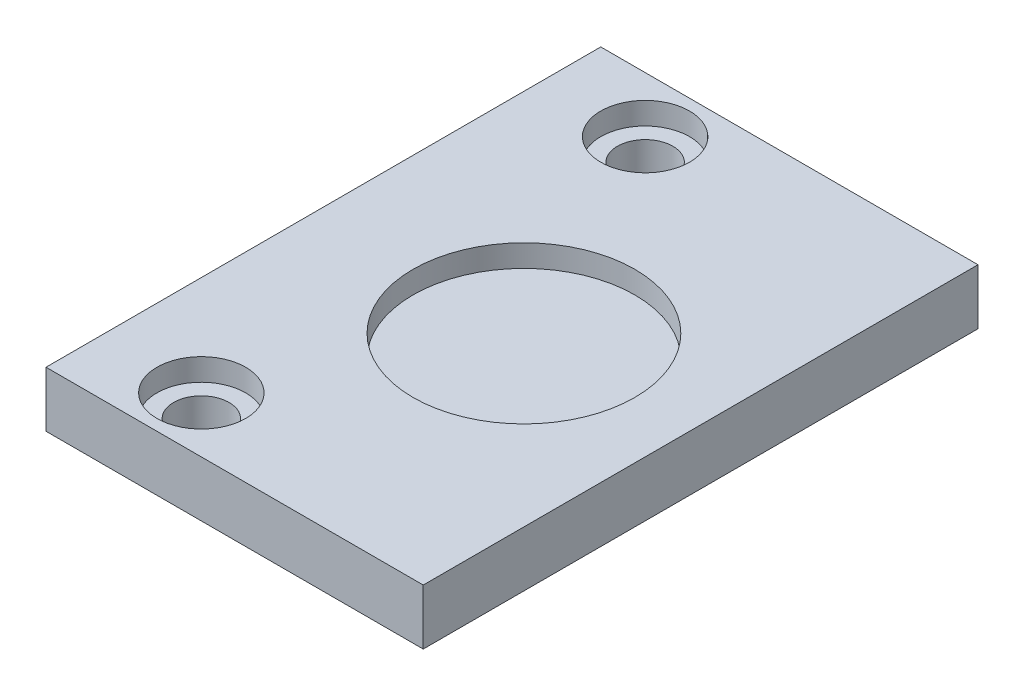
ISO-10303-21;
HEADER;
FILE_DESCRIPTION(('STEP AP214'),'2;1');
FILE_NAME('part.step','',(''),(''),'','','');
FILE_SCHEMA(('AUTOMOTIVE_DESIGN { 1 0 10303 214 1 1 1 1 }'));
ENDSEC;
DATA;
#1=APPLICATION_CONTEXT('core data for automotive mechanical design processes');
#2=APPLICATION_PROTOCOL_DEFINITION('international standard','automotive_design',2000,#1);
#3=PRODUCT_CONTEXT('',#1,'mechanical');
#4=PRODUCT('Part','Part','',(#3));
#5=PRODUCT_RELATED_PRODUCT_CATEGORY('part','',(#4));
#6=PRODUCT_DEFINITION_FORMATION('','',#4);
#7=PRODUCT_DEFINITION_CONTEXT('part definition',#1,'design');
#8=PRODUCT_DEFINITION('design','',#6,#7);
#9=PRODUCT_DEFINITION_SHAPE('','',#8);
#10=(LENGTH_UNIT() NAMED_UNIT(*) SI_UNIT(.MILLI.,.METRE.));
#11=(NAMED_UNIT(*) PLANE_ANGLE_UNIT() SI_UNIT($,.RADIAN.));
#12=(NAMED_UNIT(*) SI_UNIT($,.STERADIAN.) SOLID_ANGLE_UNIT());
#13=UNCERTAINTY_MEASURE_WITH_UNIT(LENGTH_MEASURE(1.E-05),#10,'distance_accuracy_value','');
#14=(GEOMETRIC_REPRESENTATION_CONTEXT(3) GLOBAL_UNCERTAINTY_ASSIGNED_CONTEXT((#13)) GLOBAL_UNIT_ASSIGNED_CONTEXT((#10,
#11,#12)) REPRESENTATION_CONTEXT('',''));
#15=CARTESIAN_POINT('',(0.,0.,0.));
#16=DIRECTION('',(0.,0.,1.));
#17=DIRECTION('',(1.,0.,0.));
#18=AXIS2_PLACEMENT_3D('',#15,#16,#17);
#19=CARTESIAN_POINT('',(648.607142857143,22.225,-1016.));
#20=DIRECTION('',(0.,1.,0.));
#21=DIRECTION('',(0.,0.,-1.));
#22=AXIS2_PLACEMENT_3D('',#19,#20,#21);
#23=PLANE('',#22);
#24=CARTESIAN_POINT('',(648.607142857143,22.225,-1041.4));
#25=DIRECTION('',(0.,-1.,0.));
#26=DIRECTION('',(-1.,0.,0.));
#27=AXIS2_PLACEMENT_3D('',#24,#25,#26);
#28=CIRCLE('',#27,3.17499999999995);
#29=CARTESIAN_POINT('',(651.782142857143,22.225,-1041.4));
#30=VERTEX_POINT('',#29);
#31=EDGE_CURVE('E127',#30,#30,#28,.T.);
#32=ORIENTED_EDGE('',*,*,#31,.F.);
#33=EDGE_LOOP('',(#32));
#34=FACE_BOUND('',#33,.T.);
#35=CARTESIAN_POINT('',(648.607142857143,22.225,-990.6));
#36=DIRECTION('',(0.,-1.,0.));
#37=DIRECTION('',(-1.,0.,0.));
#38=AXIS2_PLACEMENT_3D('',#35,#36,#37);
#39=CIRCLE('',#38,3.17499999999995);
#40=CARTESIAN_POINT('',(651.782142857143,22.225,-990.6));
#41=VERTEX_POINT('',#40);
#42=EDGE_CURVE('E123',#41,#41,#39,.T.);
#43=ORIENTED_EDGE('',*,*,#42,.F.);
#44=EDGE_LOOP('',(#43));
#45=FACE_BOUND('',#44,.T.);
#46=DIRECTION('',(-1.,0.,0.));
#47=VECTOR('',#46,1.);
#48=CARTESIAN_POINT('',(680.357142857143,22.225,-984.25));
#49=LINE('',#48,#47);
#50=CARTESIAN_POINT('',(680.357142857143,22.225,-984.25));
#51=VERTEX_POINT('',#50);
#52=CARTESIAN_POINT('',(637.177142857143,22.225,-984.25));
#53=VERTEX_POINT('',#52);
#54=EDGE_CURVE('E52',#51,#53,#49,.T.);
#55=ORIENTED_EDGE('',*,*,#54,.T.);
#56=DIRECTION('',(0.,0.,1.));
#57=VECTOR('',#56,1.);
#58=CARTESIAN_POINT('',(637.177142857143,22.2249999999999,0.));
#59=LINE('',#58,#57);
#60=CARTESIAN_POINT('',(637.177142857143,22.225,-1047.75));
#61=VERTEX_POINT('',#60);
#62=EDGE_CURVE('E165',#61,#53,#59,.T.);
#63=ORIENTED_EDGE('',*,*,#62,.F.);
#64=DIRECTION('',(1.,0.,0.));
#65=VECTOR('',#64,1.);
#66=CARTESIAN_POINT('',(616.857142857143,22.225,-1047.75));
#67=LINE('',#66,#65);
#68=CARTESIAN_POINT('',(680.357142857143,22.225,-1047.75));
#69=VERTEX_POINT('',#68);
#70=EDGE_CURVE('E122',#61,#69,#67,.T.);
#71=ORIENTED_EDGE('',*,*,#70,.T.);
#72=DIRECTION('',(0.,0.,1.));
#73=VECTOR('',#72,1.);
#74=CARTESIAN_POINT('',(680.357142857143,22.225,-1047.75));
#75=LINE('',#74,#73);
#76=EDGE_CURVE('E112',#69,#51,#75,.T.);
#77=ORIENTED_EDGE('',*,*,#76,.T.);
#78=EDGE_LOOP('',(#55,#63,#71,#77));
#79=FACE_BOUND('',#78,.T.);
#80=ADVANCED_FACE('F44',(#34,#45,#79),#23,.F.);
#81=CARTESIAN_POINT('',(648.607142857143,28.575,-1016.));
#82=DIRECTION('',(0.,1.,0.));
#83=DIRECTION('',(0.,0.,-1.));
#84=AXIS2_PLACEMENT_3D('',#81,#82,#83);
#85=PLANE('',#84);
#86=DIRECTION('',(0.,0.,-1.));
#87=VECTOR('',#86,1.);
#88=CARTESIAN_POINT('',(637.177142857143,28.5749999999999,0.));
#89=LINE('',#88,#87);
#90=CARTESIAN_POINT('',(637.177142857143,28.575,-984.25));
#91=VERTEX_POINT('',#90);
#92=CARTESIAN_POINT('',(637.177142857143,28.575,-1047.75));
#93=VERTEX_POINT('',#92);
#94=EDGE_CURVE('E60',#91,#93,#89,.T.);
#95=ORIENTED_EDGE('',*,*,#94,.F.);
#96=DIRECTION('',(1.,0.,0.));
#97=VECTOR('',#96,1.);
#98=CARTESIAN_POINT('',(680.357142857143,28.575,-984.25));
#99=LINE('',#98,#97);
#100=CARTESIAN_POINT('',(680.357142857143,28.575,-984.25));
#101=VERTEX_POINT('',#100);
#102=EDGE_CURVE('E11',#91,#101,#99,.T.);
#103=ORIENTED_EDGE('',*,*,#102,.T.);
#104=DIRECTION('',(0.,0.,-1.));
#105=VECTOR('',#104,1.);
#106=CARTESIAN_POINT('',(680.357142857143,28.575,-1047.75));
#107=LINE('',#106,#105);
#108=CARTESIAN_POINT('',(680.357142857143,28.575,-1047.75));
#109=VERTEX_POINT('',#108);
#110=EDGE_CURVE('E103',#101,#109,#107,.T.);
#111=ORIENTED_EDGE('',*,*,#110,.T.);
#112=DIRECTION('',(-1.,0.,0.));
#113=VECTOR('',#112,1.);
#114=CARTESIAN_POINT('',(616.857142857143,28.575,-1047.75));
#115=LINE('',#114,#113);
#116=EDGE_CURVE('E108',#109,#93,#115,.T.);
#117=ORIENTED_EDGE('',*,*,#116,.T.);
#118=EDGE_LOOP('',(#95,#103,#111,#117));
#119=FACE_BOUND('',#118,.T.);
#120=CARTESIAN_POINT('',(661.17448405176,28.575,-1014.95815576208));
#121=DIRECTION('',(0.,1.,0.));
#122=DIRECTION('',(0.,0.,1.));
#123=AXIS2_PLACEMENT_3D('',#120,#121,#122);
#124=CIRCLE('',#123,12.6999999999999);
#125=CARTESIAN_POINT('',(661.17448405176,28.575,-1002.25815576208));
#126=VERTEX_POINT('',#125);
#127=EDGE_CURVE('E162',#126,#126,#124,.T.);
#128=ORIENTED_EDGE('',*,*,#127,.F.);
#129=EDGE_LOOP('',(#128));
#130=FACE_BOUND('',#129,.T.);
#131=CARTESIAN_POINT('',(648.607142857143,28.575,-1041.4));
#132=DIRECTION('',(0.,-1.,0.));
#133=DIRECTION('',(-1.,0.,0.));
#134=AXIS2_PLACEMENT_3D('',#131,#132,#133);
#135=CIRCLE('',#134,5.08);
#136=CARTESIAN_POINT('',(653.687142857143,28.575,-1041.4));
#137=VERTEX_POINT('',#136);
#138=EDGE_CURVE('E134',#137,#137,#135,.T.);
#139=ORIENTED_EDGE('',*,*,#138,.T.);
#140=EDGE_LOOP('',(#139));
#141=FACE_BOUND('',#140,.T.);
#142=CARTESIAN_POINT('',(648.607142857143,28.575,-990.6));
#143=DIRECTION('',(0.,-1.,0.));
#144=DIRECTION('',(-1.,0.,0.));
#145=AXIS2_PLACEMENT_3D('',#142,#143,#144);
#146=CIRCLE('',#145,5.0800000000001);
#147=CARTESIAN_POINT('',(653.687142857143,28.575,-990.6));
#148=VERTEX_POINT('',#147);
#149=EDGE_CURVE('E146',#148,#148,#146,.T.);
#150=ORIENTED_EDGE('',*,*,#149,.T.);
#151=EDGE_LOOP('',(#150));
#152=FACE_BOUND('',#151,.T.);
#153=ADVANCED_FACE('F105',(#119,#130,#141,#152),#85,.T.);
#154=CARTESIAN_POINT('',(616.857142857143,22.225,-984.25));
#155=DIRECTION('',(0.,0.,1.));
#156=DIRECTION('',(1.,0.,0.));
#157=AXIS2_PLACEMENT_3D('',#154,#155,#156);
#158=PLANE('',#157);
#159=DIRECTION('',(0.,1.,0.));
#160=VECTOR('',#159,1.);
#161=CARTESIAN_POINT('',(637.177142857143,-44.446976121906,-984.25));
#162=LINE('',#161,#160);
#163=EDGE_CURVE('E170',#53,#91,#162,.T.);
#164=ORIENTED_EDGE('',*,*,#163,.F.);
#165=ORIENTED_EDGE('',*,*,#54,.F.);
#166=DIRECTION('',(0.,1.,0.));
#167=VECTOR('',#166,1.);
#168=CARTESIAN_POINT('',(680.357142857143,22.225,-984.25));
#169=LINE('',#168,#167);
#170=EDGE_CURVE('E111',#51,#101,#169,.T.);
#171=ORIENTED_EDGE('',*,*,#170,.T.);
#172=ORIENTED_EDGE('',*,*,#102,.F.);
#173=EDGE_LOOP('',(#164,#165,#171,#172));
#174=FACE_BOUND('',#173,.T.);
#175=ADVANCED_FACE('F180',(#174),#158,.T.);
#176=CARTESIAN_POINT('',(680.357142857143,22.225,-984.25));
#177=DIRECTION('',(1.,0.,0.));
#178=DIRECTION('',(0.,0.,1.));
#179=AXIS2_PLACEMENT_3D('',#176,#177,#178);
#180=PLANE('',#179);
#181=ORIENTED_EDGE('',*,*,#76,.F.);
#182=DIRECTION('',(0.,1.,0.));
#183=VECTOR('',#182,1.);
#184=CARTESIAN_POINT('',(680.357142857143,22.225,-1047.75));
#185=LINE('',#184,#183);
#186=EDGE_CURVE('E47',#69,#109,#185,.T.);
#187=ORIENTED_EDGE('',*,*,#186,.T.);
#188=ORIENTED_EDGE('',*,*,#110,.F.);
#189=ORIENTED_EDGE('',*,*,#170,.F.);
#190=EDGE_LOOP('',(#181,#187,#188,#189));
#191=FACE_BOUND('',#190,.T.);
#192=ADVANCED_FACE('F116',(#191),#180,.T.);
#193=CARTESIAN_POINT('',(680.357142857143,22.225,-1047.75));
#194=DIRECTION('',(0.,0.,-1.));
#195=DIRECTION('',(0.,-1.,0.));
#196=AXIS2_PLACEMENT_3D('',#193,#194,#195);
#197=PLANE('',#196);
#198=DIRECTION('',(0.,1.,0.));
#199=VECTOR('',#198,1.);
#200=CARTESIAN_POINT('',(637.177142857143,-44.446976121906,-1047.75));
#201=LINE('',#200,#199);
#202=EDGE_CURVE('E121',#61,#93,#201,.T.);
#203=ORIENTED_EDGE('',*,*,#202,.T.);
#204=ORIENTED_EDGE('',*,*,#116,.F.);
#205=ORIENTED_EDGE('',*,*,#186,.F.);
#206=ORIENTED_EDGE('',*,*,#70,.F.);
#207=EDGE_LOOP('',(#203,#204,#205,#206));
#208=FACE_BOUND('',#207,.T.);
#209=ADVANCED_FACE('F120',(#208),#197,.T.);
#210=CARTESIAN_POINT('',(648.607142857143,22.225,-990.6));
#211=DIRECTION('',(0.,1.,0.));
#212=DIRECTION('',(-1.,0.,0.));
#213=AXIS2_PLACEMENT_3D('',#210,#211,#212);
#214=CYLINDRICAL_SURFACE('',#213,3.17499999999995);
#215=CARTESIAN_POINT('',(648.607142857143,26.035,-990.6));
#216=DIRECTION('',(0.,1.,0.));
#217=DIRECTION('',(-1.,0.,0.));
#218=AXIS2_PLACEMENT_3D('',#215,#216,#217);
#219=CIRCLE('',#218,3.17499999999995);
#220=CARTESIAN_POINT('',(651.782142857143,26.035,-990.6));
#221=VERTEX_POINT('',#220);
#222=EDGE_CURVE('E131',#221,#221,#219,.T.);
#223=ORIENTED_EDGE('',*,*,#222,.T.);
#224=DIRECTION('',(0.,-1.,0.));
#225=VECTOR('',#224,1.);
#226=CARTESIAN_POINT('',(651.782142857143,22.225,-990.6));
#227=LINE('',#226,#225);
#228=EDGE_CURVE('E129',#221,#41,#227,.T.);
#229=ORIENTED_EDGE('',*,*,#228,.T.);
#230=ORIENTED_EDGE('',*,*,#42,.T.);
#231=ORIENTED_EDGE('',*,*,#228,.F.);
#232=EDGE_LOOP('',(#223,#229,#230,#231));
#233=FACE_BOUND('',#232,.T.);
#234=ADVANCED_FACE('F192',(#233),#214,.F.);
#235=CARTESIAN_POINT('',(648.607142857143,22.225,-1041.4));
#236=DIRECTION('',(0.,1.,0.));
#237=DIRECTION('',(-1.,0.,0.));
#238=AXIS2_PLACEMENT_3D('',#235,#236,#237);
#239=CYLINDRICAL_SURFACE('',#238,3.17499999999995);
#240=CARTESIAN_POINT('',(648.607142857143,26.035,-1041.4));
#241=DIRECTION('',(0.,1.,0.));
#242=DIRECTION('',(-1.,0.,0.));
#243=AXIS2_PLACEMENT_3D('',#240,#241,#242);
#244=CIRCLE('',#243,3.17499999999995);
#245=CARTESIAN_POINT('',(651.782142857143,26.035,-1041.4));
#246=VERTEX_POINT('',#245);
#247=EDGE_CURVE('E148',#246,#246,#244,.T.);
#248=ORIENTED_EDGE('',*,*,#247,.T.);
#249=DIRECTION('',(0.,-1.,0.));
#250=VECTOR('',#249,1.);
#251=CARTESIAN_POINT('',(651.782142857143,22.225,-1041.4));
#252=LINE('',#251,#250);
#253=EDGE_CURVE('E130',#246,#30,#252,.T.);
#254=ORIENTED_EDGE('',*,*,#253,.T.);
#255=ORIENTED_EDGE('',*,*,#31,.T.);
#256=ORIENTED_EDGE('',*,*,#253,.F.);
#257=EDGE_LOOP('',(#248,#254,#255,#256));
#258=FACE_BOUND('',#257,.T.);
#259=ADVANCED_FACE('F222',(#258),#239,.F.);
#260=CARTESIAN_POINT('',(648.607142857143,26.035,-1041.4));
#261=DIRECTION('',(0.,1.,0.));
#262=DIRECTION('',(0.,0.,-1.));
#263=AXIS2_PLACEMENT_3D('',#260,#261,#262);
#264=PLANE('',#263);
#265=ORIENTED_EDGE('',*,*,#247,.F.);
#266=EDGE_LOOP('',(#265));
#267=FACE_BOUND('',#266,.T.);
#268=CARTESIAN_POINT('',(648.607142857143,26.035,-1041.4));
#269=DIRECTION('',(0.,-1.,0.));
#270=DIRECTION('',(-1.,0.,0.));
#271=AXIS2_PLACEMENT_3D('',#268,#269,#270);
#272=CIRCLE('',#271,5.08);
#273=CARTESIAN_POINT('',(653.687142857143,26.035,-1041.4));
#274=VERTEX_POINT('',#273);
#275=EDGE_CURVE('E142',#274,#274,#272,.T.);
#276=ORIENTED_EDGE('',*,*,#275,.F.);
#277=EDGE_LOOP('',(#276));
#278=FACE_BOUND('',#277,.T.);
#279=ADVANCED_FACE('F218',(#267,#278),#264,.T.);
#280=CARTESIAN_POINT('',(648.607142857143,28.575,-1041.4));
#281=DIRECTION('',(0.,-1.,0.));
#282=DIRECTION('',(-1.,0.,0.));
#283=AXIS2_PLACEMENT_3D('',#280,#281,#282);
#284=CYLINDRICAL_SURFACE('',#283,5.08);
#285=ORIENTED_EDGE('',*,*,#138,.F.);
#286=DIRECTION('',(0.,-1.,0.));
#287=VECTOR('',#286,1.);
#288=CARTESIAN_POINT('',(653.687142857143,28.575,-1041.4));
#289=LINE('',#288,#287);
#290=EDGE_CURVE('E138',#137,#274,#289,.T.);
#291=ORIENTED_EDGE('',*,*,#290,.T.);
#292=ORIENTED_EDGE('',*,*,#275,.T.);
#293=ORIENTED_EDGE('',*,*,#290,.F.);
#294=EDGE_LOOP('',(#285,#291,#292,#293));
#295=FACE_BOUND('',#294,.T.);
#296=ADVANCED_FACE('F199',(#295),#284,.F.);
#297=CARTESIAN_POINT('',(648.607142857143,26.035,-990.6));
#298=DIRECTION('',(0.,1.,0.));
#299=DIRECTION('',(0.,0.,-1.));
#300=AXIS2_PLACEMENT_3D('',#297,#298,#299);
#301=PLANE('',#300);
#302=ORIENTED_EDGE('',*,*,#222,.F.);
#303=EDGE_LOOP('',(#302));
#304=FACE_BOUND('',#303,.T.);
#305=CARTESIAN_POINT('',(648.607142857143,26.035,-990.6));
#306=DIRECTION('',(0.,-1.,0.));
#307=DIRECTION('',(-1.,0.,0.));
#308=AXIS2_PLACEMENT_3D('',#305,#306,#307);
#309=CIRCLE('',#308,5.0800000000001);
#310=CARTESIAN_POINT('',(653.687142857143,26.035,-990.6));
#311=VERTEX_POINT('',#310);
#312=EDGE_CURVE('E135',#311,#311,#309,.T.);
#313=ORIENTED_EDGE('',*,*,#312,.F.);
#314=EDGE_LOOP('',(#313));
#315=FACE_BOUND('',#314,.T.);
#316=ADVANCED_FACE('F195',(#304,#315),#301,.T.);
#317=CARTESIAN_POINT('',(648.607142857143,28.575,-990.6));
#318=DIRECTION('',(0.,-1.,0.));
#319=DIRECTION('',(-1.,0.,0.));
#320=AXIS2_PLACEMENT_3D('',#317,#318,#319);
#321=CYLINDRICAL_SURFACE('',#320,5.0800000000001);
#322=ORIENTED_EDGE('',*,*,#149,.F.);
#323=DIRECTION('',(0.,-1.,0.));
#324=VECTOR('',#323,1.);
#325=CARTESIAN_POINT('',(653.687142857143,28.575,-990.6));
#326=LINE('',#325,#324);
#327=EDGE_CURVE('E143',#148,#311,#326,.T.);
#328=ORIENTED_EDGE('',*,*,#327,.T.);
#329=ORIENTED_EDGE('',*,*,#312,.T.);
#330=ORIENTED_EDGE('',*,*,#327,.F.);
#331=EDGE_LOOP('',(#322,#328,#329,#330));
#332=FACE_BOUND('',#331,.T.);
#333=ADVANCED_FACE('F198',(#332),#321,.F.);
#334=CARTESIAN_POINT('',(661.17448405176,26.035,-1014.95815576208));
#335=DIRECTION('',(0.,1.,0.));
#336=DIRECTION('',(0.,0.,1.));
#337=AXIS2_PLACEMENT_3D('',#334,#335,#336);
#338=CYLINDRICAL_SURFACE('',#337,12.6999999999999);
#339=CARTESIAN_POINT('',(661.17448405176,26.035,-1014.95815576208));
#340=DIRECTION('',(0.,1.,0.));
#341=DIRECTION('',(0.,0.,1.));
#342=AXIS2_PLACEMENT_3D('',#339,#340,#341);
#343=CIRCLE('',#342,12.6999999999999);
#344=CARTESIAN_POINT('',(661.17448405176,26.035,-1002.25815576208));
#345=VERTEX_POINT('',#344);
#346=EDGE_CURVE('E156',#345,#345,#343,.T.);
#347=ORIENTED_EDGE('',*,*,#346,.F.);
#348=EDGE_LOOP('',(#347));
#349=FACE_BOUND('',#348,.T.);
#350=ORIENTED_EDGE('',*,*,#127,.T.);
#351=EDGE_LOOP('',(#350));
#352=FACE_BOUND('',#351,.T.);
#353=ADVANCED_FACE('F206',(#349,#352),#338,.F.);
#354=CARTESIAN_POINT('',(661.17448405176,26.035,-1014.95815576208));
#355=DIRECTION('',(0.,1.,0.));
#356=DIRECTION('',(0.,0.,1.));
#357=AXIS2_PLACEMENT_3D('',#354,#355,#356);
#358=PLANE('',#357);
#359=ORIENTED_EDGE('',*,*,#346,.T.);
#360=EDGE_LOOP('',(#359));
#361=FACE_BOUND('',#360,.T.);
#362=ADVANCED_FACE('F211',(#361),#358,.T.);
#363=CARTESIAN_POINT('',(637.177142857143,-44.4469761219061,0.));
#364=DIRECTION('',(1.,0.,0.));
#365=DIRECTION('',(0.,1.,0.));
#366=AXIS2_PLACEMENT_3D('',#363,#364,#365);
#367=PLANE('',#366);
#368=ORIENTED_EDGE('',*,*,#62,.T.);
#369=ORIENTED_EDGE('',*,*,#163,.T.);
#370=ORIENTED_EDGE('',*,*,#94,.T.);
#371=ORIENTED_EDGE('',*,*,#202,.F.);
#372=EDGE_LOOP('',(#368,#369,#370,#371));
#373=FACE_BOUND('',#372,.T.);
#374=ADVANCED_FACE('F175',(#373),#367,.F.);
#375=CLOSED_SHELL('',(#80,#153,#175,#192,#209,#234,#259,#279,#296,#316,#333,#353,#362,#374));
#376=MANIFOLD_SOLID_BREP('B2',#375);
#377=ADVANCED_BREP_SHAPE_REPRESENTATION('',(#18,#376),#14);
#378=SHAPE_DEFINITION_REPRESENTATION(#9,#377);
ENDSEC;
END-ISO-10303-21;
